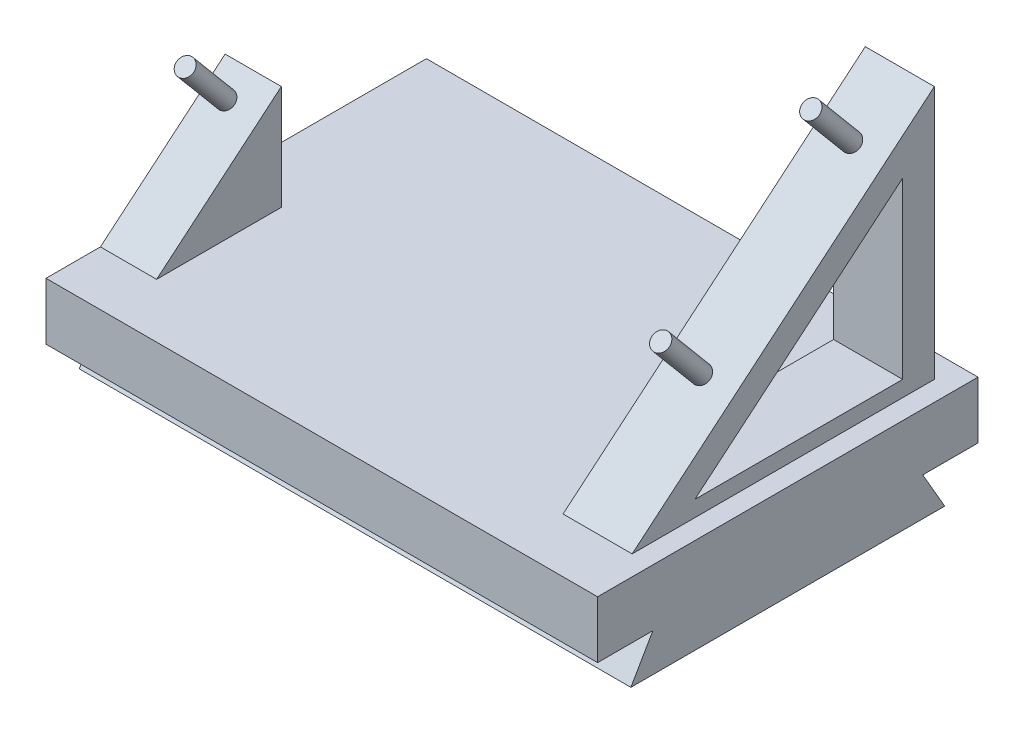
ISO-10303-21;
HEADER;
FILE_DESCRIPTION(('STEP AP214'),'2;1');
FILE_NAME('part.step','',(''),(''),'','','');
FILE_SCHEMA(('AUTOMOTIVE_DESIGN { 1 0 10303 214 1 1 1 1 }'));
ENDSEC;
DATA;
#1=APPLICATION_CONTEXT('core data for automotive mechanical design processes');
#2=APPLICATION_PROTOCOL_DEFINITION('international standard','automotive_design',2000,#1);
#3=PRODUCT_CONTEXT('',#1,'mechanical');
#4=PRODUCT('Part','Part','',(#3));
#5=PRODUCT_RELATED_PRODUCT_CATEGORY('part','',(#4));
#6=PRODUCT_DEFINITION_FORMATION('','',#4);
#7=PRODUCT_DEFINITION_CONTEXT('part definition',#1,'design');
#8=PRODUCT_DEFINITION('design','',#6,#7);
#9=PRODUCT_DEFINITION_SHAPE('','',#8);
#10=(LENGTH_UNIT() NAMED_UNIT(*) SI_UNIT(.MILLI.,.METRE.));
#11=(NAMED_UNIT(*) PLANE_ANGLE_UNIT() SI_UNIT($,.RADIAN.));
#12=(NAMED_UNIT(*) SI_UNIT($,.STERADIAN.) SOLID_ANGLE_UNIT());
#13=UNCERTAINTY_MEASURE_WITH_UNIT(LENGTH_MEASURE(1.E-05),#10,'distance_accuracy_value','');
#14=(GEOMETRIC_REPRESENTATION_CONTEXT(3) GLOBAL_UNCERTAINTY_ASSIGNED_CONTEXT((#13)) GLOBAL_UNIT_ASSIGNED_CONTEXT((#10,
#11,#12)) REPRESENTATION_CONTEXT('',''));
#15=CARTESIAN_POINT('',(0.,0.,0.));
#16=DIRECTION('',(0.,0.,1.));
#17=DIRECTION('',(1.,0.,0.));
#18=AXIS2_PLACEMENT_3D('',#15,#16,#17);
#19=CARTESIAN_POINT('',(105.1,55.,-140.));
#20=DIRECTION('',(0.,0.,1.));
#21=DIRECTION('',(1.,0.,0.));
#22=AXIS2_PLACEMENT_3D('',#19,#20,#21);
#23=PLANE('',#22);
#24=DIRECTION('',(1.,0.,0.));
#25=VECTOR('',#24,1.);
#26=CARTESIAN_POINT('',(183.23,15.,-140.));
#27=LINE('',#26,#25);
#28=CARTESIAN_POINT('',(169.2,15.,-140.));
#29=VERTEX_POINT('',#28);
#30=CARTESIAN_POINT('',(180.1,15.,-140.));
#31=VERTEX_POINT('',#30);
#32=EDGE_CURVE('E242',#29,#31,#27,.T.);
#33=ORIENTED_EDGE('',*,*,#32,.F.);
#34=DIRECTION('',(0.,-1.,0.));
#35=VECTOR('',#34,1.);
#36=CARTESIAN_POINT('',(169.2,55.,-140.));
#37=LINE('',#36,#35);
#38=CARTESIAN_POINT('',(169.2,55.,-140.));
#39=VERTEX_POINT('',#38);
#40=EDGE_CURVE('E301',#39,#29,#37,.T.);
#41=ORIENTED_EDGE('',*,*,#40,.F.);
#42=DIRECTION('',(-1.,0.,0.));
#43=VECTOR('',#42,1.);
#44=CARTESIAN_POINT('',(180.1,55.,-140.));
#45=LINE('',#44,#43);
#46=CARTESIAN_POINT('',(180.1,55.,-140.));
#47=VERTEX_POINT('',#46);
#48=EDGE_CURVE('E305',#47,#39,#45,.T.);
#49=ORIENTED_EDGE('',*,*,#48,.F.);
#50=DIRECTION('',(0.,-1.,0.));
#51=VECTOR('',#50,1.);
#52=CARTESIAN_POINT('',(180.1,55.,-140.));
#53=LINE('',#52,#51);
#54=EDGE_CURVE('E295',#47,#31,#53,.T.);
#55=ORIENTED_EDGE('',*,*,#54,.T.);
#56=EDGE_LOOP('',(#33,#41,#49,#55));
#57=FACE_BOUND('',#56,.T.);
#58=ADVANCED_FACE('F38',(#57),#23,.F.);
#59=CARTESIAN_POINT('',(0.,15.,0.));
#60=DIRECTION('',(0.,-1.,0.));
#61=DIRECTION('',(0.,0.,-1.));
#62=AXIS2_PLACEMENT_3D('',#59,#60,#61);
#63=PLANE('',#62);
#64=DIRECTION('',(1.,0.,0.));
#65=VECTOR('',#64,1.);
#66=CARTESIAN_POINT('',(183.23,15.,-143.75));
#67=LINE('',#66,#65);
#68=CARTESIAN_POINT('',(96.2323510731494,15.,-143.75));
#69=VERTEX_POINT('',#68);
#70=CARTESIAN_POINT('',(183.23,15.,-143.75));
#71=VERTEX_POINT('',#70);
#72=EDGE_CURVE('E237',#69,#71,#67,.T.);
#73=ORIENTED_EDGE('',*,*,#72,.F.);
#74=DIRECTION('',(0.,0.,1.));
#75=VECTOR('',#74,1.);
#76=CARTESIAN_POINT('',(96.2323510731494,15.,0.));
#77=LINE('',#76,#75);
#78=CARTESIAN_POINT('',(96.2323510731494,15.,-112.));
#79=VERTEX_POINT('',#78);
#80=EDGE_CURVE('E261',#69,#79,#77,.T.);
#81=ORIENTED_EDGE('',*,*,#80,.T.);
#82=DIRECTION('',(-1.,0.,0.));
#83=VECTOR('',#82,1.);
#84=CARTESIAN_POINT('',(111.232351073149,15.,-112.));
#85=LINE('',#84,#83);
#86=CARTESIAN_POINT('',(105.1,15.,-112.));
#87=VERTEX_POINT('',#86);
#88=EDGE_CURVE('E265',#87,#79,#85,.T.);
#89=ORIENTED_EDGE('',*,*,#88,.F.);
#90=DIRECTION('',(0.,0.,-1.));
#91=VECTOR('',#90,1.);
#92=CARTESIAN_POINT('',(105.1,15.,-140.));
#93=LINE('',#92,#91);
#94=CARTESIAN_POINT('',(105.1,15.,-92.3298562962317));
#95=VERTEX_POINT('',#94);
#96=EDGE_CURVE('E290',#95,#87,#93,.T.);
#97=ORIENTED_EDGE('',*,*,#96,.F.);
#98=DIRECTION('',(1.,0.,0.));
#99=VECTOR('',#98,1.);
#100=CARTESIAN_POINT('',(87.,15.,-92.3298562962317));
#101=LINE('',#100,#99);
#102=CARTESIAN_POINT('',(96.2323510731494,15.,-92.3298562962317));
#103=VERTEX_POINT('',#102);
#104=EDGE_CURVE('E289',#103,#95,#101,.T.);
#105=ORIENTED_EDGE('',*,*,#104,.F.);
#106=CARTESIAN_POINT('',(96.2323510731494,15.,-83.75));
#107=VERTEX_POINT('',#106);
#108=EDGE_CURVE('E258',#103,#107,#77,.T.);
#109=ORIENTED_EDGE('',*,*,#108,.T.);
#110=DIRECTION('',(-1.,0.,0.));
#111=VECTOR('',#110,1.);
#112=CARTESIAN_POINT('',(96.2323510731494,15.,-83.75));
#113=LINE('',#112,#111);
#114=CARTESIAN_POINT('',(183.23,15.,-83.75));
#115=VERTEX_POINT('',#114);
#116=EDGE_CURVE('E226',#115,#107,#113,.T.);
#117=ORIENTED_EDGE('',*,*,#116,.F.);
#118=DIRECTION('',(0.,0.,-1.));
#119=VECTOR('',#118,1.);
#120=CARTESIAN_POINT('',(183.23,15.,0.));
#121=LINE('',#120,#119);
#122=EDGE_CURVE('E262',#115,#71,#121,.T.);
#123=ORIENTED_EDGE('',*,*,#122,.T.);
#124=EDGE_LOOP('',(#73,#81,#89,#97,#105,#109,#117,#123));
#125=FACE_BOUND('',#124,.T.);
#126=DIRECTION('',(0.,0.,1.));
#127=VECTOR('',#126,1.);
#128=CARTESIAN_POINT('',(169.2,15.,-140.));
#129=LINE('',#128,#127);
#130=CARTESIAN_POINT('',(169.2,15.,-92.3298562962317));
#131=VERTEX_POINT('',#130);
#132=EDGE_CURVE('E299',#29,#131,#129,.T.);
#133=ORIENTED_EDGE('',*,*,#132,.F.);
#134=ORIENTED_EDGE('',*,*,#32,.T.);
#135=DIRECTION('',(0.,0.,-1.));
#136=VECTOR('',#135,1.);
#137=CARTESIAN_POINT('',(180.1,15.,-140.));
#138=LINE('',#137,#136);
#139=CARTESIAN_POINT('',(180.1,15.,-92.3298562962317));
#140=VERTEX_POINT('',#139);
#141=EDGE_CURVE('E300',#140,#31,#138,.T.);
#142=ORIENTED_EDGE('',*,*,#141,.F.);
#143=EDGE_CURVE('E315',#131,#140,#101,.T.);
#144=ORIENTED_EDGE('',*,*,#143,.F.);
#145=EDGE_LOOP('',(#133,#134,#142,#144));
#146=FACE_BOUND('',#145,.T.);
#147=ADVANCED_FACE('F378',(#125,#146),#63,.F.);
#148=CARTESIAN_POINT('',(0.,0.,0.));
#149=DIRECTION('',(0.,-1.,0.));
#150=DIRECTION('',(0.,0.,-1.));
#151=AXIS2_PLACEMENT_3D('',#148,#149,#150);
#152=PLANE('',#151);
#153=DIRECTION('',(-1.,0.,0.));
#154=VECTOR('',#153,1.);
#155=CARTESIAN_POINT('',(190.982351073149,0.,-138.5));
#156=LINE('',#155,#154);
#157=CARTESIAN_POINT('',(183.23,0.,-138.5));
#158=VERTEX_POINT('',#157);
#159=CARTESIAN_POINT('',(96.2323510731494,0.,-138.5));
#160=VERTEX_POINT('',#159);
#161=EDGE_CURVE('E193',#158,#160,#156,.T.);
#162=ORIENTED_EDGE('',*,*,#161,.F.);
#163=DIRECTION('',(0.,0.,1.));
#164=VECTOR('',#163,1.);
#165=CARTESIAN_POINT('',(183.23,0.,-163.5));
#166=LINE('',#165,#164);
#167=CARTESIAN_POINT('',(183.23,0.,-89.));
#168=VERTEX_POINT('',#167);
#169=EDGE_CURVE('E247',#158,#168,#166,.T.);
#170=ORIENTED_EDGE('',*,*,#169,.T.);
#171=DIRECTION('',(-1.,0.,0.));
#172=VECTOR('',#171,1.);
#173=CARTESIAN_POINT('',(190.982351073149,0.,-89.));
#174=LINE('',#173,#172);
#175=CARTESIAN_POINT('',(96.2323510731494,0.,-89.));
#176=VERTEX_POINT('',#175);
#177=EDGE_CURVE('E190',#168,#176,#174,.T.);
#178=ORIENTED_EDGE('',*,*,#177,.T.);
#179=DIRECTION('',(0.,0.,1.));
#180=VECTOR('',#179,1.);
#181=CARTESIAN_POINT('',(96.2323510731494,0.,-163.5));
#182=LINE('',#181,#180);
#183=EDGE_CURVE('E241',#160,#176,#182,.T.);
#184=ORIENTED_EDGE('',*,*,#183,.F.);
#185=EDGE_LOOP('',(#162,#170,#178,#184));
#186=FACE_BOUND('',#185,.T.);
#187=ADVANCED_FACE('F40',(#186),#152,.T.);
#188=CARTESIAN_POINT('',(105.1,55.,-140.));
#189=DIRECTION('',(-1.,0.,0.));
#190=DIRECTION('',(0.,0.,1.));
#191=AXIS2_PLACEMENT_3D('',#188,#189,#190);
#192=PLANE('',#191);
#193=ORIENTED_EDGE('',*,*,#96,.T.);
#194=DIRECTION('',(0.,1.,0.));
#195=VECTOR('',#194,1.);
#196=CARTESIAN_POINT('',(105.1,55.,-112.));
#197=LINE('',#196,#195);
#198=CARTESIAN_POINT('',(105.1,31.5052103270361,-112.));
#199=VERTEX_POINT('',#198);
#200=EDGE_CURVE('E269',#87,#199,#197,.T.);
#201=ORIENTED_EDGE('',*,*,#200,.T.);
#202=DIRECTION('',(0.,-0.64278760968654,0.766044443118977));
#203=VECTOR('',#202,1.);
#204=CARTESIAN_POINT('',(105.1,55.,-140.));
#205=LINE('',#204,#203);
#206=EDGE_CURVE('E273',#199,#95,#205,.T.);
#207=ORIENTED_EDGE('',*,*,#206,.T.);
#208=EDGE_LOOP('',(#193,#201,#207));
#209=FACE_BOUND('',#208,.T.);
#210=ADVANCED_FACE('F388',(#209),#192,.F.);
#211=CARTESIAN_POINT('',(180.1,55.,-140.));
#212=DIRECTION('',(-1.,0.,0.));
#213=DIRECTION('',(0.,0.,1.));
#214=AXIS2_PLACEMENT_3D('',#211,#212,#213);
#215=PLANE('',#214);
#216=DIRECTION('',(0.,-0.642787609686535,0.766044443118982));
#217=VECTOR('',#216,1.);
#218=CARTESIAN_POINT('',(180.1,45.,-135.));
#219=LINE('',#218,#217);
#220=CARTESIAN_POINT('',(180.1,45.,-135.));
#221=VERTEX_POINT('',#220);
#222=CARTESIAN_POINT('',(180.1,17.5,-102.226776203659));
#223=VERTEX_POINT('',#222);
#224=EDGE_CURVE('E169',#221,#223,#219,.T.);
#225=ORIENTED_EDGE('',*,*,#224,.F.);
#226=DIRECTION('',(0.,1.,0.));
#227=VECTOR('',#226,1.);
#228=CARTESIAN_POINT('',(180.1,17.5,-135.));
#229=LINE('',#228,#227);
#230=CARTESIAN_POINT('',(180.1,17.5,-135.));
#231=VERTEX_POINT('',#230);
#232=EDGE_CURVE('E54',#231,#221,#229,.T.);
#233=ORIENTED_EDGE('',*,*,#232,.F.);
#234=DIRECTION('',(0.,0.,-1.));
#235=VECTOR('',#234,1.);
#236=CARTESIAN_POINT('',(180.1,17.5,-102.226776203659));
#237=LINE('',#236,#235);
#238=EDGE_CURVE('E161',#223,#231,#237,.T.);
#239=ORIENTED_EDGE('',*,*,#238,.F.);
#240=EDGE_LOOP('',(#225,#233,#239));
#241=FACE_BOUND('',#240,.T.);
#242=ORIENTED_EDGE('',*,*,#54,.F.);
#243=DIRECTION('',(0.,-0.64278760968654,0.766044443118977));
#244=VECTOR('',#243,1.);
#245=CARTESIAN_POINT('',(180.1,55.,-140.));
#246=LINE('',#245,#244);
#247=EDGE_CURVE('E294',#47,#140,#246,.T.);
#248=ORIENTED_EDGE('',*,*,#247,.T.);
#249=ORIENTED_EDGE('',*,*,#141,.T.);
#250=EDGE_LOOP('',(#242,#248,#249));
#251=FACE_BOUND('',#250,.T.);
#252=ADVANCED_FACE('F174',(#241,#251),#215,.F.);
#253=CARTESIAN_POINT('',(169.2,55.,-140.));
#254=DIRECTION('',(1.,0.,0.));
#255=DIRECTION('',(0.,0.,-1.));
#256=AXIS2_PLACEMENT_3D('',#253,#254,#255);
#257=PLANE('',#256);
#258=DIRECTION('',(0.,0.,-1.));
#259=VECTOR('',#258,1.);
#260=CARTESIAN_POINT('',(169.2,17.5,-140.));
#261=LINE('',#260,#259);
#262=CARTESIAN_POINT('',(169.2,17.5,-102.226776203659));
#263=VERTEX_POINT('',#262);
#264=CARTESIAN_POINT('',(169.2,17.5,-135.));
#265=VERTEX_POINT('',#264);
#266=EDGE_CURVE('E47',#263,#265,#261,.T.);
#267=ORIENTED_EDGE('',*,*,#266,.T.);
#268=DIRECTION('',(0.,1.,0.));
#269=VECTOR('',#268,1.);
#270=CARTESIAN_POINT('',(169.2,55.,-135.));
#271=LINE('',#270,#269);
#272=CARTESIAN_POINT('',(169.2,45.,-135.));
#273=VERTEX_POINT('',#272);
#274=EDGE_CURVE('E11',#265,#273,#271,.T.);
#275=ORIENTED_EDGE('',*,*,#274,.T.);
#276=DIRECTION('',(0.,-0.642787609686535,0.766044443118982));
#277=VECTOR('',#276,1.);
#278=CARTESIAN_POINT('',(169.2,51.5937784941958,-142.858159209228));
#279=LINE('',#278,#277);
#280=EDGE_CURVE('E358',#273,#263,#279,.T.);
#281=ORIENTED_EDGE('',*,*,#280,.T.);
#282=EDGE_LOOP('',(#267,#275,#281));
#283=FACE_BOUND('',#282,.T.);
#284=ORIENTED_EDGE('',*,*,#132,.T.);
#285=DIRECTION('',(0.,0.64278760968654,-0.766044443118977));
#286=VECTOR('',#285,1.);
#287=CARTESIAN_POINT('',(169.2,55.,-140.));
#288=LINE('',#287,#286);
#289=EDGE_CURVE('E306',#131,#39,#288,.T.);
#290=ORIENTED_EDGE('',*,*,#289,.T.);
#291=ORIENTED_EDGE('',*,*,#40,.T.);
#292=EDGE_LOOP('',(#284,#290,#291));
#293=FACE_BOUND('',#292,.T.);
#294=ADVANCED_FACE('F362',(#283,#293),#257,.F.);
#295=CARTESIAN_POINT('',(87.,55.,-140.));
#296=DIRECTION('',(0.,-0.766044443118977,-0.64278760968654));
#297=DIRECTION('',(0.,0.64278760968654,-0.766044443118977));
#298=AXIS2_PLACEMENT_3D('',#295,#296,#297);
#299=PLANE('',#298);
#300=CARTESIAN_POINT('',(174.7,28.7035588877236,-108.661121832003));
#301=DIRECTION('',(0.,-0.766044443118977,-0.64278760968654));
#302=DIRECTION('',(0.,0.64278760968654,-0.766044443118977));
#303=AXIS2_PLACEMENT_3D('',#300,#301,#302);
#304=CIRCLE('',#303,1.4);
#305=CARTESIAN_POINT('',(174.7,29.6034615412848,-109.733584052369));
#306=VERTEX_POINT('',#305);
#307=EDGE_CURVE('E280',#306,#306,#304,.F.);
#308=ORIENTED_EDGE('',*,*,#307,.F.);
#309=EDGE_LOOP('',(#308));
#310=FACE_BOUND('',#309,.T.);
#311=CARTESIAN_POINT('',(174.7,48.5721239031346,-132.33955556881));
#312=DIRECTION('',(0.,-0.766044443118977,-0.64278760968654));
#313=DIRECTION('',(0.,0.64278760968654,-0.766044443118977));
#314=AXIS2_PLACEMENT_3D('',#311,#312,#313);
#315=CIRCLE('',#314,1.40000000000001);
#316=CARTESIAN_POINT('',(174.7,49.4720265566958,-133.412017789177));
#317=VERTEX_POINT('',#316);
#318=EDGE_CURVE('E285',#317,#317,#315,.F.);
#319=ORIENTED_EDGE('',*,*,#318,.F.);
#320=EDGE_LOOP('',(#319));
#321=FACE_BOUND('',#320,.T.);
#322=ORIENTED_EDGE('',*,*,#48,.T.);
#323=ORIENTED_EDGE('',*,*,#289,.F.);
#324=ORIENTED_EDGE('',*,*,#143,.T.);
#325=ORIENTED_EDGE('',*,*,#247,.F.);
#326=EDGE_LOOP('',(#322,#323,#324,#325));
#327=FACE_BOUND('',#326,.T.);
#328=ADVANCED_FACE('F393',(#310,#321,#327),#299,.F.);
#329=CARTESIAN_POINT('',(99.7,28.7035588877236,-108.661121832003));
#330=DIRECTION('',(0.,-0.766044443118977,-0.64278760968654));
#331=DIRECTION('',(0.,0.64278760968654,-0.766044443118977));
#332=AXIS2_PLACEMENT_3D('',#329,#330,#331);
#333=CIRCLE('',#332,1.375);
#334=CARTESIAN_POINT('',(99.7,29.5873918510426,-109.714432941291));
#335=VERTEX_POINT('',#334);
#336=EDGE_CURVE('E274',#335,#335,#333,.F.);
#337=ORIENTED_EDGE('',*,*,#336,.F.);
#338=EDGE_LOOP('',(#337));
#339=FACE_BOUND('',#338,.T.);
#340=DIRECTION('',(-1.,0.,0.));
#341=VECTOR('',#340,1.);
#342=CARTESIAN_POINT('',(87.,31.5052103270361,-112.));
#343=LINE('',#342,#341);
#344=CARTESIAN_POINT('',(96.2323510731494,31.5052103270361,-112.));
#345=VERTEX_POINT('',#344);
#346=EDGE_CURVE('E336',#199,#345,#343,.T.);
#347=ORIENTED_EDGE('',*,*,#346,.T.);
#348=DIRECTION('',(0.,-0.64278760968654,0.766044443118977));
#349=VECTOR('',#348,1.);
#350=CARTESIAN_POINT('',(96.2323510731494,55.,-140.));
#351=LINE('',#350,#349);
#352=EDGE_CURVE('E251',#345,#103,#351,.T.);
#353=ORIENTED_EDGE('',*,*,#352,.T.);
#354=ORIENTED_EDGE('',*,*,#104,.T.);
#355=ORIENTED_EDGE('',*,*,#206,.F.);
#356=EDGE_LOOP('',(#347,#353,#354,#355));
#357=FACE_BOUND('',#356,.T.);
#358=ADVANCED_FACE('F394',(#339,#357),#299,.F.);
#359=CARTESIAN_POINT('',(174.7,56.2325683343244,-125.911679471945));
#360=DIRECTION('',(0.,-0.766044443118977,-0.64278760968654));
#361=DIRECTION('',(0.,0.64278760968654,-0.766044443118977));
#362=AXIS2_PLACEMENT_3D('',#359,#360,#361);
#363=CYLINDRICAL_SURFACE('',#362,1.40000000000001);
#364=CARTESIAN_POINT('',(174.7,56.2325683343244,-125.911679471945));
#365=DIRECTION('',(0.,0.766044443118977,0.64278760968654));
#366=DIRECTION('',(0.,-0.64278760968654,0.766044443118977));
#367=AXIS2_PLACEMENT_3D('',#364,#365,#366);
#368=CIRCLE('',#367,1.40000000000001);
#369=CARTESIAN_POINT('',(174.7,55.3326656807632,-124.839217251578));
#370=VERTEX_POINT('',#369);
#371=EDGE_CURVE('E284',#370,#370,#368,.T.);
#372=ORIENTED_EDGE('',*,*,#371,.F.);
#373=EDGE_LOOP('',(#372));
#374=FACE_BOUND('',#373,.T.);
#375=ORIENTED_EDGE('',*,*,#318,.T.);
#376=EDGE_LOOP('',(#375));
#377=FACE_BOUND('',#376,.T.);
#378=ADVANCED_FACE('F397',(#374,#377),#363,.T.);
#379=CARTESIAN_POINT('',(174.7,56.2325683343244,-125.911679471945));
#380=DIRECTION('',(0.,0.766044443118977,0.64278760968654));
#381=DIRECTION('',(0.,-0.64278760968654,0.766044443118977));
#382=AXIS2_PLACEMENT_3D('',#379,#380,#381);
#383=PLANE('',#382);
#384=ORIENTED_EDGE('',*,*,#371,.T.);
#385=EDGE_LOOP('',(#384));
#386=FACE_BOUND('',#385,.T.);
#387=ADVANCED_FACE('F401',(#386),#383,.T.);
#388=CARTESIAN_POINT('',(174.7,36.3640033189134,-102.233245735137));
#389=DIRECTION('',(0.,-0.766044443118977,-0.64278760968654));
#390=DIRECTION('',(0.,0.64278760968654,-0.766044443118977));
#391=AXIS2_PLACEMENT_3D('',#388,#389,#390);
#392=CYLINDRICAL_SURFACE('',#391,1.4);
#393=CARTESIAN_POINT('',(174.7,36.3640033189134,-102.233245735137));
#394=DIRECTION('',(0.,0.766044443118977,0.64278760968654));
#395=DIRECTION('',(0.,-0.64278760968654,0.766044443118977));
#396=AXIS2_PLACEMENT_3D('',#393,#394,#395);
#397=CIRCLE('',#396,1.4);
#398=CARTESIAN_POINT('',(174.7,35.4641006653523,-101.160783514771));
#399=VERTEX_POINT('',#398);
#400=EDGE_CURVE('E279',#399,#399,#397,.T.);
#401=ORIENTED_EDGE('',*,*,#400,.F.);
#402=EDGE_LOOP('',(#401));
#403=FACE_BOUND('',#402,.T.);
#404=ORIENTED_EDGE('',*,*,#307,.T.);
#405=EDGE_LOOP('',(#404));
#406=FACE_BOUND('',#405,.T.);
#407=ADVANCED_FACE('F405',(#403,#406),#392,.T.);
#408=CARTESIAN_POINT('',(174.7,36.3640033189134,-102.233245735137));
#409=DIRECTION('',(0.,0.766044443118977,0.64278760968654));
#410=DIRECTION('',(0.,-0.64278760968654,0.766044443118977));
#411=AXIS2_PLACEMENT_3D('',#408,#409,#410);
#412=PLANE('',#411);
#413=ORIENTED_EDGE('',*,*,#400,.T.);
#414=EDGE_LOOP('',(#413));
#415=FACE_BOUND('',#414,.T.);
#416=ADVANCED_FACE('F409',(#415),#412,.T.);
#417=CARTESIAN_POINT('',(99.7,36.3640033189134,-102.233245735137));
#418=DIRECTION('',(0.,-0.766044443118977,-0.64278760968654));
#419=DIRECTION('',(0.,0.64278760968654,-0.766044443118977));
#420=AXIS2_PLACEMENT_3D('',#417,#418,#419);
#421=CYLINDRICAL_SURFACE('',#420,1.375);
#422=CARTESIAN_POINT('',(99.7,36.3640033189134,-102.233245735137));
#423=DIRECTION('',(0.,0.766044443118977,0.64278760968654));
#424=DIRECTION('',(0.,-0.64278760968654,0.766044443118977));
#425=AXIS2_PLACEMENT_3D('',#422,#423,#424);
#426=CIRCLE('',#425,1.375);
#427=CARTESIAN_POINT('',(99.7,35.4801703555944,-101.179934625849));
#428=VERTEX_POINT('',#427);
#429=EDGE_CURVE('E278',#428,#428,#426,.T.);
#430=ORIENTED_EDGE('',*,*,#429,.F.);
#431=EDGE_LOOP('',(#430));
#432=FACE_BOUND('',#431,.T.);
#433=ORIENTED_EDGE('',*,*,#336,.T.);
#434=EDGE_LOOP('',(#433));
#435=FACE_BOUND('',#434,.T.);
#436=ADVANCED_FACE('F413',(#432,#435),#421,.T.);
#437=CARTESIAN_POINT('',(99.7,36.3640033189134,-102.233245735137));
#438=DIRECTION('',(0.,0.766044443118977,0.64278760968654));
#439=DIRECTION('',(0.,-0.64278760968654,0.766044443118977));
#440=AXIS2_PLACEMENT_3D('',#437,#438,#439);
#441=PLANE('',#440);
#442=ORIENTED_EDGE('',*,*,#429,.T.);
#443=EDGE_LOOP('',(#442));
#444=FACE_BOUND('',#443,.T.);
#445=ADVANCED_FACE('F416',(#444),#441,.T.);
#446=CARTESIAN_POINT('',(111.232351073149,15.,-112.));
#447=DIRECTION('',(0.,0.,1.));
#448=DIRECTION('',(1.,0.,0.));
#449=AXIS2_PLACEMENT_3D('',#446,#447,#448);
#450=PLANE('',#449);
#451=ORIENTED_EDGE('',*,*,#88,.T.);
#452=DIRECTION('',(0.,1.,0.));
#453=VECTOR('',#452,1.);
#454=CARTESIAN_POINT('',(96.2323510731494,15.,-112.));
#455=LINE('',#454,#453);
#456=EDGE_CURVE('E246',#79,#345,#455,.T.);
#457=ORIENTED_EDGE('',*,*,#456,.T.);
#458=ORIENTED_EDGE('',*,*,#346,.F.);
#459=ORIENTED_EDGE('',*,*,#200,.F.);
#460=EDGE_LOOP('',(#451,#457,#458,#459));
#461=FACE_BOUND('',#460,.T.);
#462=ADVANCED_FACE('F419',(#461),#450,.F.);
#463=CARTESIAN_POINT('',(96.2323510731494,0.,-163.5));
#464=DIRECTION('',(1.,0.,0.));
#465=DIRECTION('',(0.,0.,-1.));
#466=AXIS2_PLACEMENT_3D('',#463,#464,#465);
#467=PLANE('',#466);
#468=DIRECTION('',(0.,1.,0.));
#469=VECTOR('',#468,1.);
#470=CARTESIAN_POINT('',(96.2323510731494,0.,-143.75));
#471=LINE('',#470,#469);
#472=CARTESIAN_POINT('',(96.2323510731494,6.,-143.75));
#473=VERTEX_POINT('',#472);
#474=EDGE_CURVE('E234',#473,#69,#471,.T.);
#475=ORIENTED_EDGE('',*,*,#474,.F.);
#476=DIRECTION('',(0.,0.,-1.));
#477=VECTOR('',#476,1.);
#478=CARTESIAN_POINT('',(96.2323510731494,6.,-143.75));
#479=LINE('',#478,#477);
#480=CARTESIAN_POINT('',(96.2323510731494,6.,-135.035898384862));
#481=VERTEX_POINT('',#480);
#482=EDGE_CURVE('E189',#481,#473,#479,.T.);
#483=ORIENTED_EDGE('',*,*,#482,.F.);
#484=DIRECTION('',(0.,0.866025403784436,0.500000000000005));
#485=VECTOR('',#484,1.);
#486=CARTESIAN_POINT('',(96.2323510731494,6.,-135.035898384862));
#487=LINE('',#486,#485);
#488=EDGE_CURVE('E185',#160,#481,#487,.T.);
#489=ORIENTED_EDGE('',*,*,#488,.F.);
#490=ORIENTED_EDGE('',*,*,#183,.T.);
#491=DIRECTION('',(0.,-0.86602540378444,0.499999999999997));
#492=VECTOR('',#491,1.);
#493=CARTESIAN_POINT('',(96.2323510731494,6.,-92.4641016151377));
#494=LINE('',#493,#492);
#495=CARTESIAN_POINT('',(96.2323510731494,6.,-92.4641016151377));
#496=VERTEX_POINT('',#495);
#497=EDGE_CURVE('E203',#496,#176,#494,.T.);
#498=ORIENTED_EDGE('',*,*,#497,.F.);
#499=DIRECTION('',(0.,0.,-1.));
#500=VECTOR('',#499,1.);
#501=CARTESIAN_POINT('',(96.2323510731494,6.,-83.75));
#502=LINE('',#501,#500);
#503=CARTESIAN_POINT('',(96.2323510731494,6.,-83.75));
#504=VERTEX_POINT('',#503);
#505=EDGE_CURVE('E183',#504,#496,#502,.T.);
#506=ORIENTED_EDGE('',*,*,#505,.F.);
#507=DIRECTION('',(0.,-1.,0.));
#508=VECTOR('',#507,1.);
#509=CARTESIAN_POINT('',(96.2323510731494,0.,-83.75));
#510=LINE('',#509,#508);
#511=EDGE_CURVE('E219',#107,#504,#510,.T.);
#512=ORIENTED_EDGE('',*,*,#511,.F.);
#513=ORIENTED_EDGE('',*,*,#108,.F.);
#514=ORIENTED_EDGE('',*,*,#352,.F.);
#515=ORIENTED_EDGE('',*,*,#456,.F.);
#516=ORIENTED_EDGE('',*,*,#80,.F.);
#517=EDGE_LOOP('',(#475,#483,#489,#490,#498,#506,#512,#513,#514,#515,#516));
#518=FACE_BOUND('',#517,.T.);
#519=ADVANCED_FACE('F424',(#518),#467,.F.);
#520=CARTESIAN_POINT('',(183.23,0.,-163.5));
#521=DIRECTION('',(-1.,0.,0.));
#522=DIRECTION('',(0.,0.,1.));
#523=AXIS2_PLACEMENT_3D('',#520,#521,#522);
#524=PLANE('',#523);
#525=DIRECTION('',(0.,0.866025403784436,0.500000000000005));
#526=VECTOR('',#525,1.);
#527=CARTESIAN_POINT('',(183.23,-10.8253175473056,-144.75));
#528=LINE('',#527,#526);
#529=CARTESIAN_POINT('',(183.23,6.,-135.035898384862));
#530=VERTEX_POINT('',#529);
#531=EDGE_CURVE('E354',#158,#530,#528,.T.);
#532=ORIENTED_EDGE('',*,*,#531,.T.);
#533=DIRECTION('',(0.,0.,-1.));
#534=VECTOR('',#533,1.);
#535=CARTESIAN_POINT('',(183.23,6.,-163.5));
#536=LINE('',#535,#534);
#537=CARTESIAN_POINT('',(183.23,6.,-143.75));
#538=VERTEX_POINT('',#537);
#539=EDGE_CURVE('E215',#530,#538,#536,.T.);
#540=ORIENTED_EDGE('',*,*,#539,.T.);
#541=DIRECTION('',(0.,-1.,0.));
#542=VECTOR('',#541,1.);
#543=CARTESIAN_POINT('',(183.23,0.,-143.75));
#544=LINE('',#543,#542);
#545=EDGE_CURVE('E230',#71,#538,#544,.T.);
#546=ORIENTED_EDGE('',*,*,#545,.F.);
#547=ORIENTED_EDGE('',*,*,#122,.F.);
#548=DIRECTION('',(0.,1.,0.));
#549=VECTOR('',#548,1.);
#550=CARTESIAN_POINT('',(183.23,0.,-83.75));
#551=LINE('',#550,#549);
#552=CARTESIAN_POINT('',(183.23,6.,-83.75));
#553=VERTEX_POINT('',#552);
#554=EDGE_CURVE('E223',#553,#115,#551,.T.);
#555=ORIENTED_EDGE('',*,*,#554,.F.);
#556=DIRECTION('',(0.,0.,-1.));
#557=VECTOR('',#556,1.);
#558=CARTESIAN_POINT('',(183.23,5.99999999999999,-163.5));
#559=LINE('',#558,#557);
#560=CARTESIAN_POINT('',(183.23,6.,-92.4641016151377));
#561=VERTEX_POINT('',#560);
#562=EDGE_CURVE('E197',#553,#561,#559,.T.);
#563=ORIENTED_EDGE('',*,*,#562,.T.);
#564=DIRECTION('',(0.,-0.86602540378444,0.499999999999997));
#565=VECTOR('',#564,1.);
#566=CARTESIAN_POINT('',(183.23,32.2594462909702,-107.625));
#567=LINE('',#566,#565);
#568=EDGE_CURVE('E350',#561,#168,#567,.T.);
#569=ORIENTED_EDGE('',*,*,#568,.T.);
#570=ORIENTED_EDGE('',*,*,#169,.F.);
#571=EDGE_LOOP('',(#532,#540,#546,#547,#555,#563,#569,#570));
#572=FACE_BOUND('',#571,.T.);
#573=ADVANCED_FACE('F454',(#572),#524,.F.);
#574=CARTESIAN_POINT('',(0.,0.,-143.75));
#575=DIRECTION('',(0.,0.,1.));
#576=DIRECTION('',(1.,0.,0.));
#577=AXIS2_PLACEMENT_3D('',#574,#575,#576);
#578=PLANE('',#577);
#579=ORIENTED_EDGE('',*,*,#545,.T.);
#580=DIRECTION('',(-1.,0.,0.));
#581=VECTOR('',#580,1.);
#582=CARTESIAN_POINT('',(0.,6.,-143.75));
#583=LINE('',#582,#581);
#584=EDGE_CURVE('E346',#538,#473,#583,.T.);
#585=ORIENTED_EDGE('',*,*,#584,.T.);
#586=ORIENTED_EDGE('',*,*,#474,.T.);
#587=ORIENTED_EDGE('',*,*,#72,.T.);
#588=EDGE_LOOP('',(#579,#585,#586,#587));
#589=FACE_BOUND('',#588,.T.);
#590=ADVANCED_FACE('F456',(#589),#578,.F.);
#591=CARTESIAN_POINT('',(0.,0.,-83.75));
#592=DIRECTION('',(0.,0.,-1.));
#593=DIRECTION('',(-1.,0.,0.));
#594=AXIS2_PLACEMENT_3D('',#591,#592,#593);
#595=PLANE('',#594);
#596=ORIENTED_EDGE('',*,*,#511,.T.);
#597=DIRECTION('',(1.,0.,0.));
#598=VECTOR('',#597,1.);
#599=CARTESIAN_POINT('',(0.,6.,-83.75));
#600=LINE('',#599,#598);
#601=EDGE_CURVE('E245',#504,#553,#600,.T.);
#602=ORIENTED_EDGE('',*,*,#601,.T.);
#603=ORIENTED_EDGE('',*,*,#554,.T.);
#604=ORIENTED_EDGE('',*,*,#116,.T.);
#605=EDGE_LOOP('',(#596,#602,#603,#604));
#606=FACE_BOUND('',#605,.T.);
#607=ADVANCED_FACE('F449',(#606),#595,.F.);
#608=CARTESIAN_POINT('',(190.982351073149,6.,-92.4641016151377));
#609=DIRECTION('',(0.,-0.499999999999997,-0.86602540378444));
#610=DIRECTION('',(0.,0.86602540378444,-0.499999999999997));
#611=AXIS2_PLACEMENT_3D('',#608,#609,#610);
#612=PLANE('',#611);
#613=DIRECTION('',(-1.,0.,0.));
#614=VECTOR('',#613,1.);
#615=CARTESIAN_POINT('',(190.982351073149,6.,-92.4641016151377));
#616=LINE('',#615,#614);
#617=EDGE_CURVE('E206',#561,#496,#616,.T.);
#618=ORIENTED_EDGE('',*,*,#617,.T.);
#619=ORIENTED_EDGE('',*,*,#497,.T.);
#620=ORIENTED_EDGE('',*,*,#177,.F.);
#621=ORIENTED_EDGE('',*,*,#568,.F.);
#622=EDGE_LOOP('',(#618,#619,#620,#621));
#623=FACE_BOUND('',#622,.T.);
#624=ADVANCED_FACE('F466',(#623),#612,.F.);
#625=CARTESIAN_POINT('',(190.982351073149,6.,-83.75));
#626=DIRECTION('',(0.,1.,0.));
#627=DIRECTION('',(0.,0.,1.));
#628=AXIS2_PLACEMENT_3D('',#625,#626,#627);
#629=PLANE('',#628);
#630=ORIENTED_EDGE('',*,*,#601,.F.);
#631=ORIENTED_EDGE('',*,*,#505,.T.);
#632=ORIENTED_EDGE('',*,*,#617,.F.);
#633=ORIENTED_EDGE('',*,*,#562,.F.);
#634=EDGE_LOOP('',(#630,#631,#632,#633));
#635=FACE_BOUND('',#634,.T.);
#636=ADVANCED_FACE('F469',(#635),#629,.F.);
#637=CARTESIAN_POINT('',(190.982351073149,6.,-135.035898384862));
#638=DIRECTION('',(0.,-0.500000000000005,0.866025403784436));
#639=DIRECTION('',(0.,-0.866025403784436,-0.500000000000005));
#640=AXIS2_PLACEMENT_3D('',#637,#638,#639);
#641=PLANE('',#640);
#642=ORIENTED_EDGE('',*,*,#161,.T.);
#643=ORIENTED_EDGE('',*,*,#488,.T.);
#644=DIRECTION('',(-1.,0.,0.));
#645=VECTOR('',#644,1.);
#646=CARTESIAN_POINT('',(190.982351073149,6.,-135.035898384862));
#647=LINE('',#646,#645);
#648=EDGE_CURVE('E194',#530,#481,#647,.T.);
#649=ORIENTED_EDGE('',*,*,#648,.F.);
#650=ORIENTED_EDGE('',*,*,#531,.F.);
#651=EDGE_LOOP('',(#642,#643,#649,#650));
#652=FACE_BOUND('',#651,.T.);
#653=ADVANCED_FACE('F373',(#652),#641,.F.);
#654=CARTESIAN_POINT('',(190.982351073149,6.,-143.75));
#655=DIRECTION('',(0.,1.,0.));
#656=DIRECTION('',(0.,0.,1.));
#657=AXIS2_PLACEMENT_3D('',#654,#655,#656);
#658=PLANE('',#657);
#659=ORIENTED_EDGE('',*,*,#648,.T.);
#660=ORIENTED_EDGE('',*,*,#482,.T.);
#661=ORIENTED_EDGE('',*,*,#584,.F.);
#662=ORIENTED_EDGE('',*,*,#539,.F.);
#663=EDGE_LOOP('',(#659,#660,#661,#662));
#664=FACE_BOUND('',#663,.T.);
#665=ADVANCED_FACE('F366',(#664),#658,.F.);
#666=CARTESIAN_POINT('',(164.1,17.5,-135.));
#667=DIRECTION('',(0.,0.,-1.));
#668=DIRECTION('',(-1.,0.,0.));
#669=AXIS2_PLACEMENT_3D('',#666,#667,#668);
#670=PLANE('',#669);
#671=DIRECTION('',(1.,0.,0.));
#672=VECTOR('',#671,1.);
#673=CARTESIAN_POINT('',(164.1,17.5,-135.));
#674=LINE('',#673,#672);
#675=EDGE_CURVE('E165',#265,#231,#674,.T.);
#676=ORIENTED_EDGE('',*,*,#675,.T.);
#677=ORIENTED_EDGE('',*,*,#232,.T.);
#678=DIRECTION('',(1.,0.,0.));
#679=VECTOR('',#678,1.);
#680=CARTESIAN_POINT('',(164.1,45.,-135.));
#681=LINE('',#680,#679);
#682=EDGE_CURVE('E166',#273,#221,#681,.T.);
#683=ORIENTED_EDGE('',*,*,#682,.F.);
#684=ORIENTED_EDGE('',*,*,#274,.F.);
#685=EDGE_LOOP('',(#676,#677,#683,#684));
#686=FACE_BOUND('',#685,.T.);
#687=ADVANCED_FACE('F364',(#686),#670,.F.);
#688=CARTESIAN_POINT('',(164.1,17.5,-102.226776203659));
#689=DIRECTION('',(0.,-1.,0.));
#690=DIRECTION('',(0.,0.,-1.));
#691=AXIS2_PLACEMENT_3D('',#688,#689,#690);
#692=PLANE('',#691);
#693=DIRECTION('',(1.,0.,0.));
#694=VECTOR('',#693,1.);
#695=CARTESIAN_POINT('',(164.1,17.5,-102.226776203659));
#696=LINE('',#695,#694);
#697=EDGE_CURVE('E62',#263,#223,#696,.T.);
#698=ORIENTED_EDGE('',*,*,#697,.T.);
#699=ORIENTED_EDGE('',*,*,#238,.T.);
#700=ORIENTED_EDGE('',*,*,#675,.F.);
#701=ORIENTED_EDGE('',*,*,#266,.F.);
#702=EDGE_LOOP('',(#698,#699,#700,#701));
#703=FACE_BOUND('',#702,.T.);
#704=ADVANCED_FACE('F158',(#703),#692,.F.);
#705=CARTESIAN_POINT('',(164.1,45.,-135.));
#706=DIRECTION('',(0.,0.766044443118982,0.642787609686535));
#707=DIRECTION('',(0.,-0.642787609686535,0.766044443118982));
#708=AXIS2_PLACEMENT_3D('',#705,#706,#707);
#709=PLANE('',#708);
#710=ORIENTED_EDGE('',*,*,#682,.T.);
#711=ORIENTED_EDGE('',*,*,#224,.T.);
#712=ORIENTED_EDGE('',*,*,#697,.F.);
#713=ORIENTED_EDGE('',*,*,#280,.F.);
#714=EDGE_LOOP('',(#710,#711,#712,#713));
#715=FACE_BOUND('',#714,.T.);
#716=ADVANCED_FACE('F170',(#715),#709,.F.);
#717=CLOSED_SHELL('',(#58,#147,#187,#210,#252,#294,#328,#358,#378,#387,#407,#416,#436,#445,#462,
#519,#573,#590,#607,#624,#636,#653,#665,#687,#704,#716));
#718=MANIFOLD_SOLID_BREP('B2',#717);
#719=ADVANCED_BREP_SHAPE_REPRESENTATION('',(#18,#718),#14);
#720=SHAPE_DEFINITION_REPRESENTATION(#9,#719);
ENDSEC;
END-ISO-10303-21;
